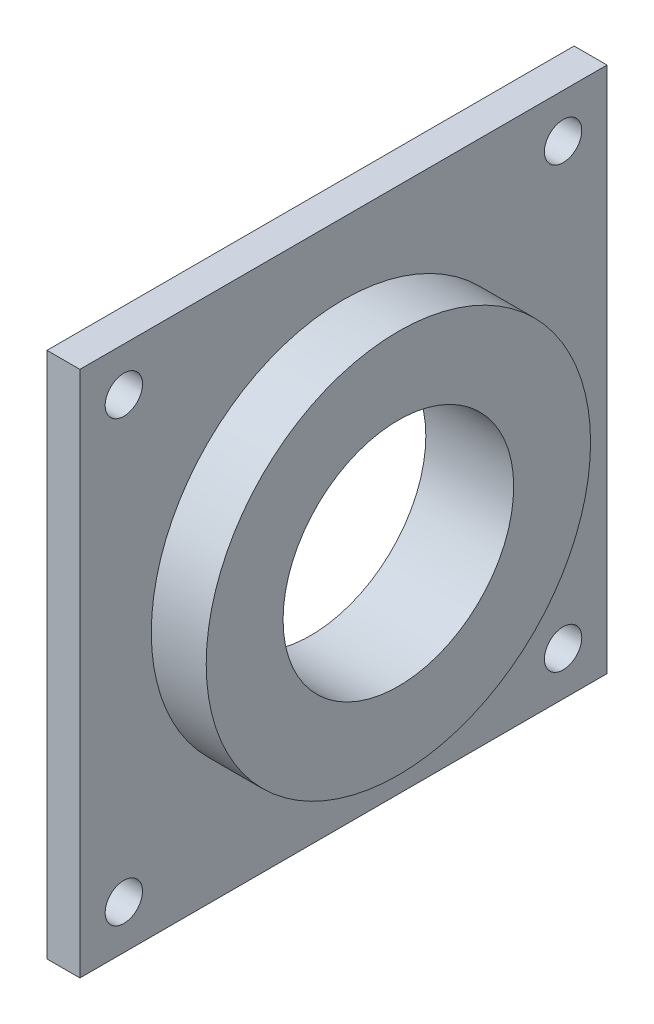
ISO-10303-21;
HEADER;
FILE_DESCRIPTION(('STEP AP214'),'2;1');
FILE_NAME('part.step','',(''),(''),'','','');
FILE_SCHEMA(('AUTOMOTIVE_DESIGN { 1 0 10303 214 1 1 1 1 }'));
ENDSEC;
DATA;
#1=APPLICATION_CONTEXT('core data for automotive mechanical design processes');
#2=APPLICATION_PROTOCOL_DEFINITION('international standard','automotive_design',2000,#1);
#3=PRODUCT_CONTEXT('',#1,'mechanical');
#4=PRODUCT('Part','Part','',(#3));
#5=PRODUCT_RELATED_PRODUCT_CATEGORY('part','',(#4));
#6=PRODUCT_DEFINITION_FORMATION('','',#4);
#7=PRODUCT_DEFINITION_CONTEXT('part definition',#1,'design');
#8=PRODUCT_DEFINITION('design','',#6,#7);
#9=PRODUCT_DEFINITION_SHAPE('','',#8);
#10=(LENGTH_UNIT() NAMED_UNIT(*) SI_UNIT(.MILLI.,.METRE.));
#11=(NAMED_UNIT(*) PLANE_ANGLE_UNIT() SI_UNIT($,.RADIAN.));
#12=(NAMED_UNIT(*) SI_UNIT($,.STERADIAN.) SOLID_ANGLE_UNIT());
#13=UNCERTAINTY_MEASURE_WITH_UNIT(LENGTH_MEASURE(1.E-05),#10,'distance_accuracy_value','');
#14=(GEOMETRIC_REPRESENTATION_CONTEXT(3) GLOBAL_UNCERTAINTY_ASSIGNED_CONTEXT((#13)) GLOBAL_UNIT_ASSIGNED_CONTEXT((#10,
#11,#12)) REPRESENTATION_CONTEXT('',''));
#15=CARTESIAN_POINT('',(0.,0.,0.));
#16=DIRECTION('',(0.,0.,1.));
#17=DIRECTION('',(1.,0.,0.));
#18=AXIS2_PLACEMENT_3D('',#15,#16,#17);
#19=CARTESIAN_POINT('',(3.0073,24.,24.));
#20=DIRECTION('',(1.,0.,0.));
#21=DIRECTION('',(0.,0.,-1.));
#22=AXIS2_PLACEMENT_3D('',#19,#20,#21);
#23=CYLINDRICAL_SURFACE('',#22,17.5);
#24=CARTESIAN_POINT('',(3.0073,24.,24.));
#25=DIRECTION('',(1.,0.,0.));
#26=DIRECTION('',(0.,0.,-1.));
#27=AXIS2_PLACEMENT_3D('',#24,#25,#26);
#28=CIRCLE('',#27,17.5);
#29=CARTESIAN_POINT('',(3.0073,24.,6.5));
#30=VERTEX_POINT('',#29);
#31=EDGE_CURVE('E66',#30,#30,#28,.F.);
#32=ORIENTED_EDGE('',*,*,#31,.F.);
#33=EDGE_LOOP('',(#32));
#34=FACE_BOUND('',#33,.T.);
#35=CARTESIAN_POINT('',(8.0073,24.,24.));
#36=DIRECTION('',(1.,0.,0.));
#37=DIRECTION('',(0.,0.,-1.));
#38=AXIS2_PLACEMENT_3D('',#35,#36,#37);
#39=CIRCLE('',#38,17.5);
#40=CARTESIAN_POINT('',(8.0073,24.,6.5));
#41=VERTEX_POINT('',#40);
#42=EDGE_CURVE('E19',#41,#41,#39,.T.);
#43=ORIENTED_EDGE('',*,*,#42,.F.);
#44=EDGE_LOOP('',(#43));
#45=FACE_BOUND('',#44,.T.);
#46=ADVANCED_FACE('F16',(#34,#45),#23,.T.);
#47=CARTESIAN_POINT('',(8.0073,24.,24.));
#48=DIRECTION('',(1.,0.,0.));
#49=DIRECTION('',(0.,0.,-1.));
#50=AXIS2_PLACEMENT_3D('',#47,#48,#49);
#51=PLANE('',#50);
#52=CARTESIAN_POINT('',(8.0073,24.,24.));
#53=DIRECTION('',(1.,0.,0.));
#54=DIRECTION('',(0.,0.,-1.));
#55=AXIS2_PLACEMENT_3D('',#52,#53,#54);
#56=CIRCLE('',#55,10.5);
#57=CARTESIAN_POINT('',(8.0073,24.,13.5));
#58=VERTEX_POINT('',#57);
#59=EDGE_CURVE('E96',#58,#58,#56,.F.);
#60=ORIENTED_EDGE('',*,*,#59,.T.);
#61=EDGE_LOOP('',(#60));
#62=FACE_BOUND('',#61,.T.);
#63=ORIENTED_EDGE('',*,*,#42,.T.);
#64=EDGE_LOOP('',(#63));
#65=FACE_BOUND('',#64,.T.);
#66=ADVANCED_FACE('F113',(#62,#65),#51,.T.);
#67=CARTESIAN_POINT('',(3.0073,0.,0.));
#68=DIRECTION('',(1.,0.,0.));
#69=DIRECTION('',(0.,0.,-1.));
#70=AXIS2_PLACEMENT_3D('',#67,#68,#69);
#71=PLANE('',#70);
#72=CARTESIAN_POINT('',(3.0073,4.,44.));
#73=DIRECTION('',(1.,0.,0.));
#74=DIRECTION('',(0.,0.,-1.));
#75=AXIS2_PLACEMENT_3D('',#72,#73,#74);
#76=CIRCLE('',#75,1.7);
#77=CARTESIAN_POINT('',(3.0073,4.,42.3));
#78=VERTEX_POINT('',#77);
#79=EDGE_CURVE('E93',#78,#78,#76,.F.);
#80=ORIENTED_EDGE('',*,*,#79,.T.);
#81=EDGE_LOOP('',(#80));
#82=FACE_BOUND('',#81,.T.);
#83=ORIENTED_EDGE('',*,*,#31,.T.);
#84=EDGE_LOOP('',(#83));
#85=FACE_BOUND('',#84,.T.);
#86=CARTESIAN_POINT('',(3.0073,4.,4.));
#87=DIRECTION('',(1.,0.,0.));
#88=DIRECTION('',(0.,0.,-1.));
#89=AXIS2_PLACEMENT_3D('',#86,#87,#88);
#90=CIRCLE('',#89,1.7);
#91=CARTESIAN_POINT('',(3.0073,4.,2.3));
#92=VERTEX_POINT('',#91);
#93=EDGE_CURVE('E99',#92,#92,#90,.F.);
#94=ORIENTED_EDGE('',*,*,#93,.T.);
#95=EDGE_LOOP('',(#94));
#96=FACE_BOUND('',#95,.T.);
#97=CARTESIAN_POINT('',(3.0073,44.,44.));
#98=DIRECTION('',(1.,0.,0.));
#99=DIRECTION('',(0.,0.,-1.));
#100=AXIS2_PLACEMENT_3D('',#97,#98,#99);
#101=CIRCLE('',#100,1.7);
#102=CARTESIAN_POINT('',(3.0073,44.,42.3));
#103=VERTEX_POINT('',#102);
#104=EDGE_CURVE('E102',#103,#103,#101,.F.);
#105=ORIENTED_EDGE('',*,*,#104,.T.);
#106=EDGE_LOOP('',(#105));
#107=FACE_BOUND('',#106,.T.);
#108=CARTESIAN_POINT('',(3.0073,44.,4.));
#109=DIRECTION('',(1.,0.,0.));
#110=DIRECTION('',(0.,0.,-1.));
#111=AXIS2_PLACEMENT_3D('',#108,#109,#110);
#112=CIRCLE('',#111,1.7);
#113=CARTESIAN_POINT('',(3.0073,44.,2.3));
#114=VERTEX_POINT('',#113);
#115=EDGE_CURVE('E105',#114,#114,#112,.F.);
#116=ORIENTED_EDGE('',*,*,#115,.T.);
#117=EDGE_LOOP('',(#116));
#118=FACE_BOUND('',#117,.T.);
#119=DIRECTION('',(0.,0.,1.));
#120=VECTOR('',#119,1.);
#121=CARTESIAN_POINT('',(3.0073,48.,0.));
#122=LINE('',#121,#120);
#123=CARTESIAN_POINT('',(3.0073,48.,48.));
#124=VERTEX_POINT('',#123);
#125=CARTESIAN_POINT('',(3.0073,48.,0.));
#126=VERTEX_POINT('',#125);
#127=EDGE_CURVE('E257',#124,#126,#122,.F.);
#128=ORIENTED_EDGE('',*,*,#127,.F.);
#129=DIRECTION('',(0.,1.,0.));
#130=VECTOR('',#129,1.);
#131=CARTESIAN_POINT('',(3.0073,0.,48.));
#132=LINE('',#131,#130);
#133=CARTESIAN_POINT('',(3.0073,0.,48.));
#134=VERTEX_POINT('',#133);
#135=EDGE_CURVE('E60',#134,#124,#132,.T.);
#136=ORIENTED_EDGE('',*,*,#135,.F.);
#137=DIRECTION('',(0.,0.,1.));
#138=VECTOR('',#137,1.);
#139=CARTESIAN_POINT('',(3.0073,0.,0.));
#140=LINE('',#139,#138);
#141=CARTESIAN_POINT('',(3.0073,0.,0.));
#142=VERTEX_POINT('',#141);
#143=EDGE_CURVE('E58',#134,#142,#140,.F.);
#144=ORIENTED_EDGE('',*,*,#143,.T.);
#145=DIRECTION('',(0.,1.,0.));
#146=VECTOR('',#145,1.);
#147=CARTESIAN_POINT('',(3.0073,0.,0.));
#148=LINE('',#147,#146);
#149=EDGE_CURVE('E55',#142,#126,#148,.T.);
#150=ORIENTED_EDGE('',*,*,#149,.T.);
#151=EDGE_LOOP('',(#128,#136,#144,#150));
#152=FACE_BOUND('',#151,.T.);
#153=ADVANCED_FACE('F59',(#82,#85,#96,#107,#118,#152),#71,.T.);
#154=CARTESIAN_POINT('',(0.007300000000001,0.,0.));
#155=DIRECTION('',(0.,1.,0.));
#156=DIRECTION('',(0.,0.,1.));
#157=AXIS2_PLACEMENT_3D('',#154,#155,#156);
#158=PLANE('',#157);
#159=DIRECTION('',(1.,0.,0.));
#160=VECTOR('',#159,1.);
#161=CARTESIAN_POINT('',(0.007300000000001,0.,48.));
#162=LINE('',#161,#160);
#163=CARTESIAN_POINT('',(0.007300000000001,0.,48.));
#164=VERTEX_POINT('',#163);
#165=EDGE_CURVE('E261',#164,#134,#162,.T.);
#166=ORIENTED_EDGE('',*,*,#165,.F.);
#167=DIRECTION('',(0.,0.,-1.));
#168=VECTOR('',#167,1.);
#169=CARTESIAN_POINT('',(0.007300000000001,0.,0.));
#170=LINE('',#169,#168);
#171=CARTESIAN_POINT('',(0.007300000000001,0.,0.));
#172=VERTEX_POINT('',#171);
#173=EDGE_CURVE('E77',#164,#172,#170,.T.);
#174=ORIENTED_EDGE('',*,*,#173,.T.);
#175=DIRECTION('',(1.,0.,0.));
#176=VECTOR('',#175,1.);
#177=CARTESIAN_POINT('',(0.007300000000001,0.,0.));
#178=LINE('',#177,#176);
#179=EDGE_CURVE('E65',#172,#142,#178,.T.);
#180=ORIENTED_EDGE('',*,*,#179,.T.);
#181=ORIENTED_EDGE('',*,*,#143,.F.);
#182=EDGE_LOOP('',(#166,#174,#180,#181));
#183=FACE_BOUND('',#182,.T.);
#184=ADVANCED_FACE('F76',(#183),#158,.F.);
#185=CARTESIAN_POINT('',(0.007300000000001,0.,0.));
#186=DIRECTION('',(0.,0.,1.));
#187=DIRECTION('',(1.,0.,0.));
#188=AXIS2_PLACEMENT_3D('',#185,#186,#187);
#189=PLANE('',#188);
#190=ORIENTED_EDGE('',*,*,#149,.F.);
#191=ORIENTED_EDGE('',*,*,#179,.F.);
#192=DIRECTION('',(0.,1.,0.));
#193=VECTOR('',#192,1.);
#194=CARTESIAN_POINT('',(0.007300000000001,0.,0.));
#195=LINE('',#194,#193);
#196=CARTESIAN_POINT('',(0.007300000000001,48.,0.));
#197=VERTEX_POINT('',#196);
#198=EDGE_CURVE('E268',#172,#197,#195,.T.);
#199=ORIENTED_EDGE('',*,*,#198,.T.);
#200=DIRECTION('',(1.,0.,0.));
#201=VECTOR('',#200,1.);
#202=CARTESIAN_POINT('',(0.007300000000001,48.,0.));
#203=LINE('',#202,#201);
#204=EDGE_CURVE('E73',#126,#197,#203,.F.);
#205=ORIENTED_EDGE('',*,*,#204,.F.);
#206=EDGE_LOOP('',(#190,#191,#199,#205));
#207=FACE_BOUND('',#206,.T.);
#208=ADVANCED_FACE('F70',(#207),#189,.F.);
#209=CARTESIAN_POINT('',(0.007300000000001,48.,0.));
#210=DIRECTION('',(0.,1.,0.));
#211=DIRECTION('',(0.,0.,1.));
#212=AXIS2_PLACEMENT_3D('',#209,#210,#211);
#213=PLANE('',#212);
#214=DIRECTION('',(1.,0.,0.));
#215=VECTOR('',#214,1.);
#216=CARTESIAN_POINT('',(0.007300000000001,48.,48.));
#217=LINE('',#216,#215);
#218=CARTESIAN_POINT('',(0.007300000000001,48.,48.));
#219=VERTEX_POINT('',#218);
#220=EDGE_CURVE('E34',#124,#219,#217,.F.);
#221=ORIENTED_EDGE('',*,*,#220,.F.);
#222=ORIENTED_EDGE('',*,*,#127,.T.);
#223=ORIENTED_EDGE('',*,*,#204,.T.);
#224=DIRECTION('',(0.,0.,-1.));
#225=VECTOR('',#224,1.);
#226=CARTESIAN_POINT('',(0.007300000000001,48.,0.));
#227=LINE('',#226,#225);
#228=EDGE_CURVE('E259',#197,#219,#227,.F.);
#229=ORIENTED_EDGE('',*,*,#228,.T.);
#230=EDGE_LOOP('',(#221,#222,#223,#229));
#231=FACE_BOUND('',#230,.T.);
#232=ADVANCED_FACE('F154',(#231),#213,.T.);
#233=CARTESIAN_POINT('',(0.007300000000001,0.,48.));
#234=DIRECTION('',(0.,0.,1.));
#235=DIRECTION('',(1.,0.,0.));
#236=AXIS2_PLACEMENT_3D('',#233,#234,#235);
#237=PLANE('',#236);
#238=ORIENTED_EDGE('',*,*,#135,.T.);
#239=ORIENTED_EDGE('',*,*,#220,.T.);
#240=DIRECTION('',(0.,1.,0.));
#241=VECTOR('',#240,1.);
#242=CARTESIAN_POINT('',(0.007300000000001,0.,48.));
#243=LINE('',#242,#241);
#244=EDGE_CURVE('E92',#219,#164,#243,.F.);
#245=ORIENTED_EDGE('',*,*,#244,.T.);
#246=ORIENTED_EDGE('',*,*,#165,.T.);
#247=EDGE_LOOP('',(#238,#239,#245,#246));
#248=FACE_BOUND('',#247,.T.);
#249=ADVANCED_FACE('F150',(#248),#237,.T.);
#250=CARTESIAN_POINT('',(0.007300000000001,44.,4.));
#251=DIRECTION('',(1.,0.,0.));
#252=DIRECTION('',(0.,0.,-1.));
#253=AXIS2_PLACEMENT_3D('',#250,#251,#252);
#254=CYLINDRICAL_SURFACE('',#253,1.7);
#255=CARTESIAN_POINT('',(0.007300000000001,44.,4.));
#256=DIRECTION('',(1.,0.,0.));
#257=DIRECTION('',(0.,0.,-1.));
#258=AXIS2_PLACEMENT_3D('',#255,#256,#257);
#259=CIRCLE('',#258,1.7);
#260=CARTESIAN_POINT('',(0.007300000000001,44.,2.3));
#261=VERTEX_POINT('',#260);
#262=EDGE_CURVE('E89',#261,#261,#259,.F.);
#263=ORIENTED_EDGE('',*,*,#262,.T.);
#264=EDGE_LOOP('',(#263));
#265=FACE_BOUND('',#264,.T.);
#266=ORIENTED_EDGE('',*,*,#115,.F.);
#267=EDGE_LOOP('',(#266));
#268=FACE_BOUND('',#267,.T.);
#269=ADVANCED_FACE('F146',(#265,#268),#254,.F.);
#270=CARTESIAN_POINT('',(0.007300000000001,44.,44.));
#271=DIRECTION('',(1.,0.,0.));
#272=DIRECTION('',(0.,0.,-1.));
#273=AXIS2_PLACEMENT_3D('',#270,#271,#272);
#274=CYLINDRICAL_SURFACE('',#273,1.7);
#275=CARTESIAN_POINT('',(0.007300000000001,44.,44.));
#276=DIRECTION('',(1.,0.,0.));
#277=DIRECTION('',(0.,0.,-1.));
#278=AXIS2_PLACEMENT_3D('',#275,#276,#277);
#279=CIRCLE('',#278,1.7);
#280=CARTESIAN_POINT('',(0.007300000000001,44.,42.3));
#281=VERTEX_POINT('',#280);
#282=EDGE_CURVE('E86',#281,#281,#279,.F.);
#283=ORIENTED_EDGE('',*,*,#282,.T.);
#284=EDGE_LOOP('',(#283));
#285=FACE_BOUND('',#284,.T.);
#286=ORIENTED_EDGE('',*,*,#104,.F.);
#287=EDGE_LOOP('',(#286));
#288=FACE_BOUND('',#287,.T.);
#289=ADVANCED_FACE('F142',(#285,#288),#274,.F.);
#290=CARTESIAN_POINT('',(0.007300000000001,4.,4.));
#291=DIRECTION('',(1.,0.,0.));
#292=DIRECTION('',(0.,0.,-1.));
#293=AXIS2_PLACEMENT_3D('',#290,#291,#292);
#294=CYLINDRICAL_SURFACE('',#293,1.7);
#295=CARTESIAN_POINT('',(0.007300000000001,4.,4.));
#296=DIRECTION('',(1.,0.,0.));
#297=DIRECTION('',(0.,0.,-1.));
#298=AXIS2_PLACEMENT_3D('',#295,#296,#297);
#299=CIRCLE('',#298,1.7);
#300=CARTESIAN_POINT('',(0.007300000000001,4.,2.3));
#301=VERTEX_POINT('',#300);
#302=EDGE_CURVE('E83',#301,#301,#299,.F.);
#303=ORIENTED_EDGE('',*,*,#302,.T.);
#304=EDGE_LOOP('',(#303));
#305=FACE_BOUND('',#304,.T.);
#306=ORIENTED_EDGE('',*,*,#93,.F.);
#307=EDGE_LOOP('',(#306));
#308=FACE_BOUND('',#307,.T.);
#309=ADVANCED_FACE('F138',(#305,#308),#294,.F.);
#310=CARTESIAN_POINT('',(0.007300000000001,24.,24.));
#311=DIRECTION('',(1.,0.,0.));
#312=DIRECTION('',(0.,0.,-1.));
#313=AXIS2_PLACEMENT_3D('',#310,#311,#312);
#314=CYLINDRICAL_SURFACE('',#313,10.5);
#315=CARTESIAN_POINT('',(0.007300000000001,24.,24.));
#316=DIRECTION('',(1.,0.,0.));
#317=DIRECTION('',(0.,0.,-1.));
#318=AXIS2_PLACEMENT_3D('',#315,#316,#317);
#319=CIRCLE('',#318,10.5);
#320=CARTESIAN_POINT('',(0.007300000000001,24.,13.5));
#321=VERTEX_POINT('',#320);
#322=EDGE_CURVE('E25',#321,#321,#319,.F.);
#323=ORIENTED_EDGE('',*,*,#322,.T.);
#324=EDGE_LOOP('',(#323));
#325=FACE_BOUND('',#324,.T.);
#326=ORIENTED_EDGE('',*,*,#59,.F.);
#327=EDGE_LOOP('',(#326));
#328=FACE_BOUND('',#327,.T.);
#329=ADVANCED_FACE('F130',(#325,#328),#314,.F.);
#330=CARTESIAN_POINT('',(0.007300000000001,4.,44.));
#331=DIRECTION('',(1.,0.,0.));
#332=DIRECTION('',(0.,0.,-1.));
#333=AXIS2_PLACEMENT_3D('',#330,#331,#332);
#334=CYLINDRICAL_SURFACE('',#333,1.7);
#335=CARTESIAN_POINT('',(0.007300000000001,4.,44.));
#336=DIRECTION('',(1.,0.,0.));
#337=DIRECTION('',(0.,0.,-1.));
#338=AXIS2_PLACEMENT_3D('',#335,#336,#337);
#339=CIRCLE('',#338,1.7);
#340=CARTESIAN_POINT('',(0.007300000000001,4.,42.3));
#341=VERTEX_POINT('',#340);
#342=EDGE_CURVE('E11',#341,#341,#339,.F.);
#343=ORIENTED_EDGE('',*,*,#342,.T.);
#344=EDGE_LOOP('',(#343));
#345=FACE_BOUND('',#344,.T.);
#346=ORIENTED_EDGE('',*,*,#79,.F.);
#347=EDGE_LOOP('',(#346));
#348=FACE_BOUND('',#347,.T.);
#349=ADVANCED_FACE('F124',(#345,#348),#334,.F.);
#350=CARTESIAN_POINT('',(0.007300000000001,0.,0.));
#351=DIRECTION('',(1.,0.,0.));
#352=DIRECTION('',(0.,0.,-1.));
#353=AXIS2_PLACEMENT_3D('',#350,#351,#352);
#354=PLANE('',#353);
#355=ORIENTED_EDGE('',*,*,#342,.F.);
#356=EDGE_LOOP('',(#355));
#357=FACE_BOUND('',#356,.T.);
#358=ORIENTED_EDGE('',*,*,#322,.F.);
#359=EDGE_LOOP('',(#358));
#360=FACE_BOUND('',#359,.T.);
#361=ORIENTED_EDGE('',*,*,#302,.F.);
#362=EDGE_LOOP('',(#361));
#363=FACE_BOUND('',#362,.T.);
#364=ORIENTED_EDGE('',*,*,#282,.F.);
#365=EDGE_LOOP('',(#364));
#366=FACE_BOUND('',#365,.T.);
#367=ORIENTED_EDGE('',*,*,#262,.F.);
#368=EDGE_LOOP('',(#367));
#369=FACE_BOUND('',#368,.T.);
#370=ORIENTED_EDGE('',*,*,#228,.F.);
#371=ORIENTED_EDGE('',*,*,#198,.F.);
#372=ORIENTED_EDGE('',*,*,#173,.F.);
#373=ORIENTED_EDGE('',*,*,#244,.F.);
#374=EDGE_LOOP('',(#370,#371,#372,#373));
#375=FACE_BOUND('',#374,.T.);
#376=ADVANCED_FACE('F122',(#357,#360,#363,#366,#369,#375),#354,.F.);
#377=CLOSED_SHELL('',(#46,#66,#153,#184,#208,#232,#249,#269,#289,#309,#329,#349,#376));
#378=MANIFOLD_SOLID_BREP('B1',#377);
#379=ADVANCED_BREP_SHAPE_REPRESENTATION('',(#18,#378),#14);
#380=SHAPE_DEFINITION_REPRESENTATION(#9,#379);
ENDSEC;
END-ISO-10303-21;
